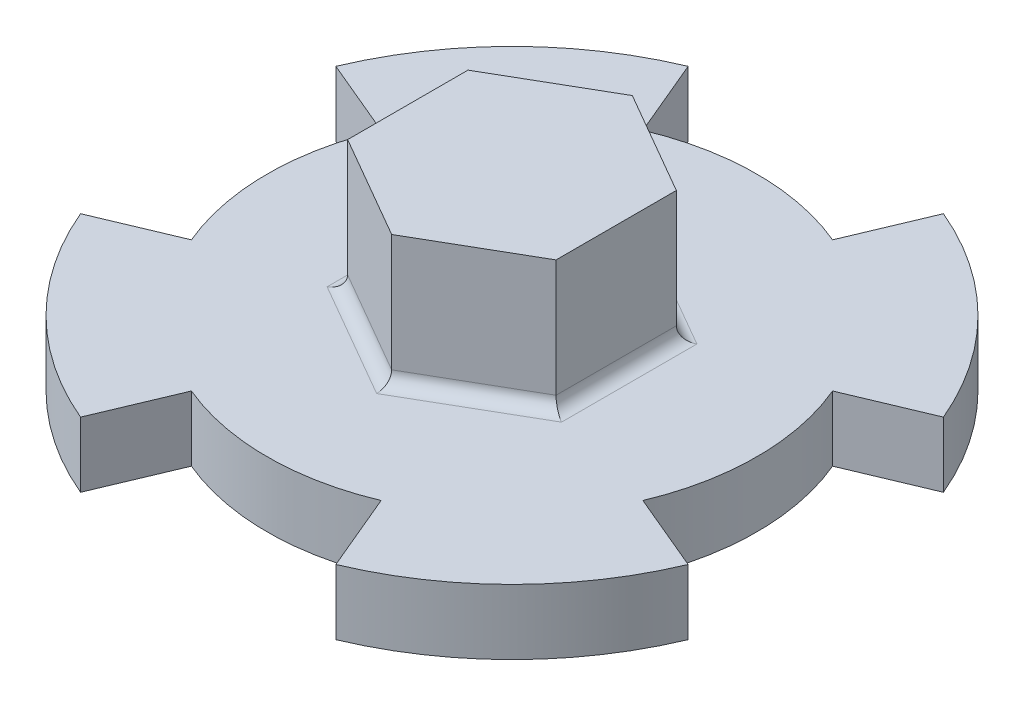
ISO-10303-21;
HEADER;
FILE_DESCRIPTION(('STEP AP214'),'2;1');
FILE_NAME('part.step','',(''),(''),'','','');
FILE_SCHEMA(('AUTOMOTIVE_DESIGN { 1 0 10303 214 1 1 1 1 }'));
ENDSEC;
DATA;
#1=APPLICATION_CONTEXT('core data for automotive mechanical design processes');
#2=APPLICATION_PROTOCOL_DEFINITION('international standard','automotive_design',2000,#1);
#3=PRODUCT_CONTEXT('',#1,'mechanical');
#4=PRODUCT('Part','Part','',(#3));
#5=PRODUCT_RELATED_PRODUCT_CATEGORY('part','',(#4));
#6=PRODUCT_DEFINITION_FORMATION('','',#4);
#7=PRODUCT_DEFINITION_CONTEXT('part definition',#1,'design');
#8=PRODUCT_DEFINITION('design','',#6,#7);
#9=PRODUCT_DEFINITION_SHAPE('','',#8);
#10=(LENGTH_UNIT() NAMED_UNIT(*) SI_UNIT(.MILLI.,.METRE.));
#11=(NAMED_UNIT(*) PLANE_ANGLE_UNIT() SI_UNIT($,.RADIAN.));
#12=(NAMED_UNIT(*) SI_UNIT($,.STERADIAN.) SOLID_ANGLE_UNIT());
#13=UNCERTAINTY_MEASURE_WITH_UNIT(LENGTH_MEASURE(1.E-05),#10,'distance_accuracy_value','');
#14=(GEOMETRIC_REPRESENTATION_CONTEXT(3) GLOBAL_UNCERTAINTY_ASSIGNED_CONTEXT((#13)) GLOBAL_UNIT_ASSIGNED_CONTEXT((#10,
#11,#12)) REPRESENTATION_CONTEXT('',''));
#15=CARTESIAN_POINT('',(0.,0.,0.));
#16=DIRECTION('',(0.,0.,1.));
#17=DIRECTION('',(1.,0.,0.));
#18=AXIS2_PLACEMENT_3D('',#15,#16,#17);
#19=CARTESIAN_POINT('',(0.,5.,0.));
#20=DIRECTION('',(0.,-1.,0.));
#21=DIRECTION('',(0.,0.,-1.));
#22=AXIS2_PLACEMENT_3D('',#19,#20,#21);
#23=CYLINDRICAL_SURFACE('',#22,18.8);
#24=CARTESIAN_POINT('',(0.,0.,0.));
#25=DIRECTION('',(0.,1.,0.));
#26=DIRECTION('',(0.,0.,1.));
#27=AXIS2_PLACEMENT_3D('',#24,#25,#26);
#28=CIRCLE('',#27,18.8);
#29=CARTESIAN_POINT('',(-7.2822134387353,0.,17.3323214669214));
#30=VERTEX_POINT('',#29);
#31=CARTESIAN_POINT('',(7.28221343873506,0.,17.3323214669215));
#32=VERTEX_POINT('',#31);
#33=EDGE_CURVE('E229',#30,#32,#28,.T.);
#34=ORIENTED_EDGE('',*,*,#33,.T.);
#35=DIRECTION('',(0.,-1.,0.));
#36=VECTOR('',#35,1.);
#37=CARTESIAN_POINT('',(7.28221343873506,5.,17.3323214669215));
#38=LINE('',#37,#36);
#39=CARTESIAN_POINT('',(7.28221343873506,5.,17.3323214669215));
#40=VERTEX_POINT('',#39);
#41=EDGE_CURVE('E385',#40,#32,#38,.T.);
#42=ORIENTED_EDGE('',*,*,#41,.F.);
#43=CARTESIAN_POINT('',(0.,5.,0.));
#44=DIRECTION('',(0.,1.,0.));
#45=DIRECTION('',(0.,0.,1.));
#46=AXIS2_PLACEMENT_3D('',#43,#44,#45);
#47=CIRCLE('',#46,18.8);
#48=CARTESIAN_POINT('',(-7.2822134387353,5.,17.3323214669214));
#49=VERTEX_POINT('',#48);
#50=EDGE_CURVE('E242',#49,#40,#47,.T.);
#51=ORIENTED_EDGE('',*,*,#50,.F.);
#52=DIRECTION('',(0.,-1.,0.));
#53=VECTOR('',#52,1.);
#54=CARTESIAN_POINT('',(-7.2822134387353,5.,17.3323214669214));
#55=LINE('',#54,#53);
#56=EDGE_CURVE('E289',#49,#30,#55,.T.);
#57=ORIENTED_EDGE('',*,*,#56,.T.);
#58=EDGE_LOOP('',(#34,#42,#51,#57));
#59=FACE_BOUND('',#58,.T.);
#60=ADVANCED_FACE('F39',(#59),#23,.T.);
#61=CARTESIAN_POINT('',(0.,5.,0.));
#62=DIRECTION('',(0.921931992921354,0.,-0.38735177865612));
#63=DIRECTION('',(-0.38735177865612,0.,-0.921931992921355));
#64=AXIS2_PLACEMENT_3D('',#61,#62,#63);
#65=PLANE('',#64);
#66=DIRECTION('',(0.38735177865612,0.,0.921931992921354));
#67=VECTOR('',#66,1.);
#68=CARTESIAN_POINT('',(0.,0.,0.));
#69=LINE('',#68,#67);
#70=CARTESIAN_POINT('',(9.79999999999984,0.,23.3248794209103));
#71=VERTEX_POINT('',#70);
#72=EDGE_CURVE('E234',#32,#71,#69,.T.);
#73=ORIENTED_EDGE('',*,*,#72,.T.);
#74=DIRECTION('',(0.,-1.,0.));
#75=VECTOR('',#74,1.);
#76=CARTESIAN_POINT('',(9.79999999999984,5.,23.3248794209103));
#77=LINE('',#76,#75);
#78=CARTESIAN_POINT('',(9.79999999999984,5.,23.3248794209103));
#79=VERTEX_POINT('',#78);
#80=EDGE_CURVE('E381',#79,#71,#77,.T.);
#81=ORIENTED_EDGE('',*,*,#80,.F.);
#82=DIRECTION('',(0.38735177865612,0.,0.921931992921354));
#83=VECTOR('',#82,1.);
#84=CARTESIAN_POINT('',(0.,5.,0.));
#85=LINE('',#84,#83);
#86=EDGE_CURVE('E246',#40,#79,#85,.T.);
#87=ORIENTED_EDGE('',*,*,#86,.F.);
#88=ORIENTED_EDGE('',*,*,#41,.T.);
#89=EDGE_LOOP('',(#73,#81,#87,#88));
#90=FACE_BOUND('',#89,.T.);
#91=ADVANCED_FACE('F505',(#90),#65,.F.);
#92=CARTESIAN_POINT('',(0.,5.,0.));
#93=DIRECTION('',(0.,-1.,0.));
#94=DIRECTION('',(0.,0.,-1.));
#95=AXIS2_PLACEMENT_3D('',#92,#93,#94);
#96=CYLINDRICAL_SURFACE('',#95,25.3);
#97=CARTESIAN_POINT('',(0.,0.,0.));
#98=DIRECTION('',(0.,1.,0.));
#99=DIRECTION('',(0.,0.,1.));
#100=AXIS2_PLACEMENT_3D('',#97,#98,#99);
#101=CIRCLE('',#100,25.3);
#102=CARTESIAN_POINT('',(23.3248794209102,0.,9.8));
#103=VERTEX_POINT('',#102);
#104=EDGE_CURVE('E293',#71,#103,#101,.T.);
#105=ORIENTED_EDGE('',*,*,#104,.T.);
#106=DIRECTION('',(0.,-1.,0.));
#107=VECTOR('',#106,1.);
#108=CARTESIAN_POINT('',(23.3248794209102,5.,9.8));
#109=LINE('',#108,#107);
#110=CARTESIAN_POINT('',(23.3248794209102,5.,9.8));
#111=VERTEX_POINT('',#110);
#112=EDGE_CURVE('E378',#111,#103,#109,.T.);
#113=ORIENTED_EDGE('',*,*,#112,.F.);
#114=CARTESIAN_POINT('',(0.,5.,0.));
#115=DIRECTION('',(0.,1.,0.));
#116=DIRECTION('',(0.,0.,1.));
#117=AXIS2_PLACEMENT_3D('',#114,#115,#116);
#118=CIRCLE('',#117,25.3);
#119=EDGE_CURVE('E252',#79,#111,#118,.T.);
#120=ORIENTED_EDGE('',*,*,#119,.F.);
#121=ORIENTED_EDGE('',*,*,#80,.T.);
#122=EDGE_LOOP('',(#105,#113,#120,#121));
#123=FACE_BOUND('',#122,.T.);
#124=ADVANCED_FACE('F513',(#123),#96,.T.);
#125=CARTESIAN_POINT('',(0.,5.,0.));
#126=DIRECTION('',(0.387351778656127,0.,-0.921931992921352));
#127=DIRECTION('',(-0.921931992921352,0.,-0.387351778656127));
#128=AXIS2_PLACEMENT_3D('',#125,#126,#127);
#129=PLANE('',#128);
#130=DIRECTION('',(0.921931992921352,0.,0.387351778656127));
#131=VECTOR('',#130,1.);
#132=CARTESIAN_POINT('',(0.,0.,0.));
#133=LINE('',#132,#131);
#134=CARTESIAN_POINT('',(17.3323214669214,0.,7.28221343873518));
#135=VERTEX_POINT('',#134);
#136=EDGE_CURVE('E297',#135,#103,#133,.T.);
#137=ORIENTED_EDGE('',*,*,#136,.F.);
#138=DIRECTION('',(0.,-1.,0.));
#139=VECTOR('',#138,1.);
#140=CARTESIAN_POINT('',(17.3323214669214,5.,7.28221343873518));
#141=LINE('',#140,#139);
#142=CARTESIAN_POINT('',(17.3323214669214,5.,7.28221343873518));
#143=VERTEX_POINT('',#142);
#144=EDGE_CURVE('E375',#143,#135,#141,.T.);
#145=ORIENTED_EDGE('',*,*,#144,.F.);
#146=DIRECTION('',(0.921931992921352,0.,0.387351778656127));
#147=VECTOR('',#146,1.);
#148=CARTESIAN_POINT('',(0.,5.,0.));
#149=LINE('',#148,#147);
#150=EDGE_CURVE('E255',#143,#111,#149,.T.);
#151=ORIENTED_EDGE('',*,*,#150,.T.);
#152=ORIENTED_EDGE('',*,*,#112,.T.);
#153=EDGE_LOOP('',(#137,#145,#151,#152));
#154=FACE_BOUND('',#153,.T.);
#155=ADVANCED_FACE('F520',(#154),#129,.T.);
#156=CARTESIAN_POINT('',(17.3323214669214,0.,-7.28221343873518));
#157=VERTEX_POINT('',#156);
#158=EDGE_CURVE('E237',#135,#157,#28,.T.);
#159=ORIENTED_EDGE('',*,*,#158,.T.);
#160=DIRECTION('',(0.,-1.,0.));
#161=VECTOR('',#160,1.);
#162=CARTESIAN_POINT('',(17.3323214669214,5.,-7.28221343873518));
#163=LINE('',#162,#161);
#164=CARTESIAN_POINT('',(17.3323214669214,5.,-7.28221343873518));
#165=VERTEX_POINT('',#164);
#166=EDGE_CURVE('E371',#165,#157,#163,.T.);
#167=ORIENTED_EDGE('',*,*,#166,.F.);
#168=EDGE_CURVE('E249',#143,#165,#47,.T.);
#169=ORIENTED_EDGE('',*,*,#168,.F.);
#170=ORIENTED_EDGE('',*,*,#144,.T.);
#171=EDGE_LOOP('',(#159,#167,#169,#170));
#172=FACE_BOUND('',#171,.T.);
#173=ADVANCED_FACE('F508',(#172),#23,.T.);
#174=CARTESIAN_POINT('',(0.,5.,0.));
#175=DIRECTION('',(-0.387351778656127,0.,-0.921931992921352));
#176=DIRECTION('',(-0.921931992921352,0.,0.387351778656127));
#177=AXIS2_PLACEMENT_3D('',#174,#175,#176);
#178=PLANE('',#177);
#179=DIRECTION('',(0.921931992921352,0.,-0.387351778656127));
#180=VECTOR('',#179,1.);
#181=CARTESIAN_POINT('',(0.,0.,0.));
#182=LINE('',#181,#180);
#183=CARTESIAN_POINT('',(23.3248794209102,0.,-9.80000000000001));
#184=VERTEX_POINT('',#183);
#185=EDGE_CURVE('E301',#157,#184,#182,.T.);
#186=ORIENTED_EDGE('',*,*,#185,.T.);
#187=DIRECTION('',(0.,-1.,0.));
#188=VECTOR('',#187,1.);
#189=CARTESIAN_POINT('',(23.3248794209102,5.,-9.80000000000001));
#190=LINE('',#189,#188);
#191=CARTESIAN_POINT('',(23.3248794209102,5.,-9.80000000000001));
#192=VERTEX_POINT('',#191);
#193=EDGE_CURVE('E367',#192,#184,#190,.T.);
#194=ORIENTED_EDGE('',*,*,#193,.F.);
#195=DIRECTION('',(0.921931992921352,0.,-0.387351778656127));
#196=VECTOR('',#195,1.);
#197=CARTESIAN_POINT('',(0.,5.,0.));
#198=LINE('',#197,#196);
#199=EDGE_CURVE('E259',#165,#192,#198,.T.);
#200=ORIENTED_EDGE('',*,*,#199,.F.);
#201=ORIENTED_EDGE('',*,*,#166,.T.);
#202=EDGE_LOOP('',(#186,#194,#200,#201));
#203=FACE_BOUND('',#202,.T.);
#204=ADVANCED_FACE('F519',(#203),#178,.F.);
#205=CARTESIAN_POINT('',(0.,5.,0.));
#206=DIRECTION('',(0.,-1.,0.));
#207=DIRECTION('',(0.,0.,-1.));
#208=AXIS2_PLACEMENT_3D('',#205,#206,#207);
#209=CYLINDRICAL_SURFACE('',#208,25.3);
#210=CARTESIAN_POINT('',(0.,0.,0.));
#211=DIRECTION('',(0.,1.,0.));
#212=DIRECTION('',(0.,0.,1.));
#213=AXIS2_PLACEMENT_3D('',#210,#211,#212);
#214=CIRCLE('',#213,25.3);
#215=CARTESIAN_POINT('',(9.8,0.,-23.3248794209102));
#216=VERTEX_POINT('',#215);
#217=EDGE_CURVE('E304',#184,#216,#214,.T.);
#218=ORIENTED_EDGE('',*,*,#217,.T.);
#219=DIRECTION('',(0.,-1.,0.));
#220=VECTOR('',#219,1.);
#221=CARTESIAN_POINT('',(9.8,5.,-23.3248794209102));
#222=LINE('',#221,#220);
#223=CARTESIAN_POINT('',(9.8,5.,-23.3248794209102));
#224=VERTEX_POINT('',#223);
#225=EDGE_CURVE('E364',#224,#216,#222,.T.);
#226=ORIENTED_EDGE('',*,*,#225,.F.);
#227=CARTESIAN_POINT('',(0.,5.,0.));
#228=DIRECTION('',(0.,1.,0.));
#229=DIRECTION('',(0.,0.,1.));
#230=AXIS2_PLACEMENT_3D('',#227,#228,#229);
#231=CIRCLE('',#230,25.3);
#232=EDGE_CURVE('E262',#192,#224,#231,.T.);
#233=ORIENTED_EDGE('',*,*,#232,.F.);
#234=ORIENTED_EDGE('',*,*,#193,.T.);
#235=EDGE_LOOP('',(#218,#226,#233,#234));
#236=FACE_BOUND('',#235,.T.);
#237=ADVANCED_FACE('F545',(#236),#209,.T.);
#238=CARTESIAN_POINT('',(0.,5.,0.));
#239=DIRECTION('',(-0.921931992921352,0.,-0.387351778656126));
#240=DIRECTION('',(-0.387351778656126,0.,0.921931992921352));
#241=AXIS2_PLACEMENT_3D('',#238,#239,#240);
#242=PLANE('',#241);
#243=DIRECTION('',(0.387351778656126,0.,-0.921931992921352));
#244=VECTOR('',#243,1.);
#245=CARTESIAN_POINT('',(0.,0.,0.));
#246=LINE('',#245,#244);
#247=CARTESIAN_POINT('',(7.28221343873518,0.,-17.3323214669214));
#248=VERTEX_POINT('',#247);
#249=EDGE_CURVE('E308',#248,#216,#246,.T.);
#250=ORIENTED_EDGE('',*,*,#249,.F.);
#251=DIRECTION('',(0.,-1.,0.));
#252=VECTOR('',#251,1.);
#253=CARTESIAN_POINT('',(7.28221343873518,5.,-17.3323214669214));
#254=LINE('',#253,#252);
#255=CARTESIAN_POINT('',(7.28221343873518,5.,-17.3323214669214));
#256=VERTEX_POINT('',#255);
#257=EDGE_CURVE('E361',#256,#248,#254,.T.);
#258=ORIENTED_EDGE('',*,*,#257,.F.);
#259=DIRECTION('',(0.387351778656126,0.,-0.921931992921352));
#260=VECTOR('',#259,1.);
#261=CARTESIAN_POINT('',(0.,5.,0.));
#262=LINE('',#261,#260);
#263=EDGE_CURVE('E265',#256,#224,#262,.T.);
#264=ORIENTED_EDGE('',*,*,#263,.T.);
#265=ORIENTED_EDGE('',*,*,#225,.T.);
#266=EDGE_LOOP('',(#250,#258,#264,#265));
#267=FACE_BOUND('',#266,.T.);
#268=ADVANCED_FACE('F537',(#267),#242,.T.);
#269=CARTESIAN_POINT('',(-7.28221343873518,0.,-17.3323214669214));
#270=VERTEX_POINT('',#269);
#271=EDGE_CURVE('E312',#248,#270,#28,.T.);
#272=ORIENTED_EDGE('',*,*,#271,.T.);
#273=DIRECTION('',(0.,-1.,0.));
#274=VECTOR('',#273,1.);
#275=CARTESIAN_POINT('',(-7.28221343873518,5.,-17.3323214669214));
#276=LINE('',#275,#274);
#277=CARTESIAN_POINT('',(-7.28221343873518,5.,-17.3323214669214));
#278=VERTEX_POINT('',#277);
#279=EDGE_CURVE('E357',#278,#270,#276,.T.);
#280=ORIENTED_EDGE('',*,*,#279,.F.);
#281=EDGE_CURVE('E269',#256,#278,#47,.T.);
#282=ORIENTED_EDGE('',*,*,#281,.F.);
#283=ORIENTED_EDGE('',*,*,#257,.T.);
#284=EDGE_LOOP('',(#272,#280,#282,#283));
#285=FACE_BOUND('',#284,.T.);
#286=ADVANCED_FACE('F522',(#285),#23,.T.);
#287=CARTESIAN_POINT('',(0.,5.,0.));
#288=DIRECTION('',(-0.921931992921352,0.,0.387351778656126));
#289=DIRECTION('',(0.387351778656126,0.,0.921931992921352));
#290=AXIS2_PLACEMENT_3D('',#287,#288,#289);
#291=PLANE('',#290);
#292=DIRECTION('',(-0.387351778656126,0.,-0.921931992921352));
#293=VECTOR('',#292,1.);
#294=CARTESIAN_POINT('',(0.,0.,0.));
#295=LINE('',#294,#293);
#296=CARTESIAN_POINT('',(-9.8,0.,-23.3248794209102));
#297=VERTEX_POINT('',#296);
#298=EDGE_CURVE('E313',#270,#297,#295,.T.);
#299=ORIENTED_EDGE('',*,*,#298,.T.);
#300=DIRECTION('',(0.,-1.,0.));
#301=VECTOR('',#300,1.);
#302=CARTESIAN_POINT('',(-9.8,5.,-23.3248794209102));
#303=LINE('',#302,#301);
#304=CARTESIAN_POINT('',(-9.8,5.,-23.3248794209102));
#305=VERTEX_POINT('',#304);
#306=EDGE_CURVE('E353',#305,#297,#303,.T.);
#307=ORIENTED_EDGE('',*,*,#306,.F.);
#308=DIRECTION('',(-0.387351778656126,0.,-0.921931992921352));
#309=VECTOR('',#308,1.);
#310=CARTESIAN_POINT('',(0.,5.,0.));
#311=LINE('',#310,#309);
#312=EDGE_CURVE('E270',#278,#305,#311,.T.);
#313=ORIENTED_EDGE('',*,*,#312,.F.);
#314=ORIENTED_EDGE('',*,*,#279,.T.);
#315=EDGE_LOOP('',(#299,#307,#313,#314));
#316=FACE_BOUND('',#315,.T.);
#317=ADVANCED_FACE('F536',(#316),#291,.F.);
#318=CARTESIAN_POINT('',(0.,5.,0.));
#319=DIRECTION('',(0.,-1.,0.));
#320=DIRECTION('',(0.,0.,-1.));
#321=AXIS2_PLACEMENT_3D('',#318,#319,#320);
#322=CYLINDRICAL_SURFACE('',#321,25.3);
#323=CARTESIAN_POINT('',(0.,0.,0.));
#324=DIRECTION('',(0.,1.,0.));
#325=DIRECTION('',(0.,0.,1.));
#326=AXIS2_PLACEMENT_3D('',#323,#324,#325);
#327=CIRCLE('',#326,25.3);
#328=CARTESIAN_POINT('',(-23.3248794209102,0.,-9.79999999999999));
#329=VERTEX_POINT('',#328);
#330=EDGE_CURVE('E316',#297,#329,#327,.T.);
#331=ORIENTED_EDGE('',*,*,#330,.T.);
#332=DIRECTION('',(0.,-1.,0.));
#333=VECTOR('',#332,1.);
#334=CARTESIAN_POINT('',(-23.3248794209102,5.,-9.79999999999999));
#335=LINE('',#334,#333);
#336=CARTESIAN_POINT('',(-23.3248794209102,5.,-9.79999999999999));
#337=VERTEX_POINT('',#336);
#338=EDGE_CURVE('E350',#337,#329,#335,.T.);
#339=ORIENTED_EDGE('',*,*,#338,.F.);
#340=CARTESIAN_POINT('',(0.,5.,0.));
#341=DIRECTION('',(0.,1.,0.));
#342=DIRECTION('',(0.,0.,1.));
#343=AXIS2_PLACEMENT_3D('',#340,#341,#342);
#344=CIRCLE('',#343,25.3);
#345=EDGE_CURVE('E273',#305,#337,#344,.T.);
#346=ORIENTED_EDGE('',*,*,#345,.F.);
#347=ORIENTED_EDGE('',*,*,#306,.T.);
#348=EDGE_LOOP('',(#331,#339,#346,#347));
#349=FACE_BOUND('',#348,.T.);
#350=ADVANCED_FACE('F533',(#349),#322,.T.);
#351=CARTESIAN_POINT('',(0.,5.,0.));
#352=DIRECTION('',(-0.387351778656126,0.,0.921931992921352));
#353=DIRECTION('',(0.921931992921352,0.,0.387351778656126));
#354=AXIS2_PLACEMENT_3D('',#351,#352,#353);
#355=PLANE('',#354);
#356=DIRECTION('',(-0.921931992921352,0.,-0.387351778656126));
#357=VECTOR('',#356,1.);
#358=CARTESIAN_POINT('',(0.,0.,0.));
#359=LINE('',#358,#357);
#360=CARTESIAN_POINT('',(-17.3323214669214,0.,-7.28221343873517));
#361=VERTEX_POINT('',#360);
#362=EDGE_CURVE('E320',#361,#329,#359,.T.);
#363=ORIENTED_EDGE('',*,*,#362,.F.);
#364=DIRECTION('',(0.,-1.,0.));
#365=VECTOR('',#364,1.);
#366=CARTESIAN_POINT('',(-17.3323214669214,5.,-7.28221343873517));
#367=LINE('',#366,#365);
#368=CARTESIAN_POINT('',(-17.3323214669214,5.,-7.28221343873517));
#369=VERTEX_POINT('',#368);
#370=EDGE_CURVE('E347',#369,#361,#367,.T.);
#371=ORIENTED_EDGE('',*,*,#370,.F.);
#372=DIRECTION('',(-0.921931992921352,0.,-0.387351778656126));
#373=VECTOR('',#372,1.);
#374=CARTESIAN_POINT('',(0.,5.,0.));
#375=LINE('',#374,#373);
#376=EDGE_CURVE('E276',#369,#337,#375,.T.);
#377=ORIENTED_EDGE('',*,*,#376,.T.);
#378=ORIENTED_EDGE('',*,*,#338,.T.);
#379=EDGE_LOOP('',(#363,#371,#377,#378));
#380=FACE_BOUND('',#379,.T.);
#381=ADVANCED_FACE('F525',(#380),#355,.T.);
#382=CARTESIAN_POINT('',(-17.3323214669214,0.,7.28221343873518));
#383=VERTEX_POINT('',#382);
#384=EDGE_CURVE('E236',#361,#383,#28,.T.);
#385=ORIENTED_EDGE('',*,*,#384,.T.);
#386=DIRECTION('',(0.,-1.,0.));
#387=VECTOR('',#386,1.);
#388=CARTESIAN_POINT('',(-17.3323214669214,5.,7.28221343873518));
#389=LINE('',#388,#387);
#390=CARTESIAN_POINT('',(-17.3323214669214,5.,7.28221343873518));
#391=VERTEX_POINT('',#390);
#392=EDGE_CURVE('E343',#391,#383,#389,.T.);
#393=ORIENTED_EDGE('',*,*,#392,.F.);
#394=EDGE_CURVE('E248',#369,#391,#47,.T.);
#395=ORIENTED_EDGE('',*,*,#394,.F.);
#396=ORIENTED_EDGE('',*,*,#370,.T.);
#397=EDGE_LOOP('',(#385,#393,#395,#396));
#398=FACE_BOUND('',#397,.T.);
#399=ADVANCED_FACE('F509',(#398),#23,.T.);
#400=CARTESIAN_POINT('',(0.,5.,0.));
#401=DIRECTION('',(0.387351778656126,0.,0.921931992921352));
#402=DIRECTION('',(0.921931992921352,0.,-0.387351778656126));
#403=AXIS2_PLACEMENT_3D('',#400,#401,#402);
#404=PLANE('',#403);
#405=DIRECTION('',(-0.921931992921352,0.,0.387351778656126));
#406=VECTOR('',#405,1.);
#407=CARTESIAN_POINT('',(0.,0.,0.));
#408=LINE('',#407,#406);
#409=CARTESIAN_POINT('',(-23.3248794209102,0.,9.8));
#410=VERTEX_POINT('',#409);
#411=EDGE_CURVE('E324',#383,#410,#408,.T.);
#412=ORIENTED_EDGE('',*,*,#411,.T.);
#413=DIRECTION('',(0.,-1.,0.));
#414=VECTOR('',#413,1.);
#415=CARTESIAN_POINT('',(-23.3248794209102,5.,9.8));
#416=LINE('',#415,#414);
#417=CARTESIAN_POINT('',(-23.3248794209102,5.,9.8));
#418=VERTEX_POINT('',#417);
#419=EDGE_CURVE('E339',#418,#410,#416,.T.);
#420=ORIENTED_EDGE('',*,*,#419,.F.);
#421=DIRECTION('',(-0.921931992921352,0.,0.387351778656126));
#422=VECTOR('',#421,1.);
#423=CARTESIAN_POINT('',(0.,5.,0.));
#424=LINE('',#423,#422);
#425=EDGE_CURVE('E280',#391,#418,#424,.T.);
#426=ORIENTED_EDGE('',*,*,#425,.F.);
#427=ORIENTED_EDGE('',*,*,#392,.T.);
#428=EDGE_LOOP('',(#412,#420,#426,#427));
#429=FACE_BOUND('',#428,.T.);
#430=ADVANCED_FACE('F524',(#429),#404,.F.);
#431=CARTESIAN_POINT('',(0.,5.,0.));
#432=DIRECTION('',(0.,-1.,0.));
#433=DIRECTION('',(0.,0.,-1.));
#434=AXIS2_PLACEMENT_3D('',#431,#432,#433);
#435=CYLINDRICAL_SURFACE('',#434,25.3);
#436=CARTESIAN_POINT('',(0.,0.,0.));
#437=DIRECTION('',(0.,1.,0.));
#438=DIRECTION('',(0.,0.,1.));
#439=AXIS2_PLACEMENT_3D('',#436,#437,#438);
#440=CIRCLE('',#439,25.3);
#441=CARTESIAN_POINT('',(-9.80000000000016,0.,23.3248794209101));
#442=VERTEX_POINT('',#441);
#443=EDGE_CURVE('E327',#410,#442,#440,.T.);
#444=ORIENTED_EDGE('',*,*,#443,.T.);
#445=DIRECTION('',(0.,-1.,0.));
#446=VECTOR('',#445,1.);
#447=CARTESIAN_POINT('',(-9.80000000000016,5.,23.3248794209101));
#448=LINE('',#447,#446);
#449=CARTESIAN_POINT('',(-9.80000000000016,5.,23.3248794209101));
#450=VERTEX_POINT('',#449);
#451=EDGE_CURVE('E336',#450,#442,#448,.T.);
#452=ORIENTED_EDGE('',*,*,#451,.F.);
#453=CARTESIAN_POINT('',(0.,5.,0.));
#454=DIRECTION('',(0.,1.,0.));
#455=DIRECTION('',(0.,0.,1.));
#456=AXIS2_PLACEMENT_3D('',#453,#454,#455);
#457=CIRCLE('',#456,25.3);
#458=EDGE_CURVE('E283',#418,#450,#457,.T.);
#459=ORIENTED_EDGE('',*,*,#458,.F.);
#460=ORIENTED_EDGE('',*,*,#419,.T.);
#461=EDGE_LOOP('',(#444,#452,#459,#460));
#462=FACE_BOUND('',#461,.T.);
#463=ADVANCED_FACE('F531',(#462),#435,.T.);
#464=CARTESIAN_POINT('',(0.,5.,0.));
#465=DIRECTION('',(0.921931992921349,0.,0.387351778656133));
#466=DIRECTION('',(0.387351778656133,0.,-0.921931992921349));
#467=AXIS2_PLACEMENT_3D('',#464,#465,#466);
#468=PLANE('',#467);
#469=DIRECTION('',(-0.387351778656133,0.,0.921931992921349));
#470=VECTOR('',#469,1.);
#471=CARTESIAN_POINT('',(0.,0.,0.));
#472=LINE('',#471,#470);
#473=EDGE_CURVE('E247',#30,#442,#472,.T.);
#474=ORIENTED_EDGE('',*,*,#473,.F.);
#475=ORIENTED_EDGE('',*,*,#56,.F.);
#476=DIRECTION('',(-0.387351778656133,0.,0.921931992921349));
#477=VECTOR('',#476,1.);
#478=CARTESIAN_POINT('',(0.,5.,0.));
#479=LINE('',#478,#477);
#480=EDGE_CURVE('E286',#49,#450,#479,.T.);
#481=ORIENTED_EDGE('',*,*,#480,.T.);
#482=ORIENTED_EDGE('',*,*,#451,.T.);
#483=EDGE_LOOP('',(#474,#475,#481,#482));
#484=FACE_BOUND('',#483,.T.);
#485=ADVANCED_FACE('F584',(#484),#468,.T.);
#486=CARTESIAN_POINT('',(0.,5.,0.));
#487=DIRECTION('',(0.,1.,0.));
#488=DIRECTION('',(0.,0.,1.));
#489=AXIS2_PLACEMENT_3D('',#486,#487,#488);
#490=PLANE('',#489);
#491=DIRECTION('',(0.,0.,-1.));
#492=VECTOR('',#491,1.);
#493=CARTESIAN_POINT('',(9.,5.,0.));
#494=LINE('',#493,#492);
#495=CARTESIAN_POINT('',(9.,5.,-5.19615242270663));
#496=VERTEX_POINT('',#495);
#497=CARTESIAN_POINT('',(9.,5.,5.19615242270663));
#498=VERTEX_POINT('',#497);
#499=EDGE_CURVE('E393',#496,#498,#494,.F.);
#500=ORIENTED_EDGE('',*,*,#499,.T.);
#501=DIRECTION('',(0.866025403784439,0.,-0.5));
#502=VECTOR('',#501,1.);
#503=CARTESIAN_POINT('',(4.5,5.,7.79422863405995));
#504=LINE('',#503,#502);
#505=CARTESIAN_POINT('',(0.,5.,10.3923048454133));
#506=VERTEX_POINT('',#505);
#507=EDGE_CURVE('E408',#498,#506,#504,.F.);
#508=ORIENTED_EDGE('',*,*,#507,.T.);
#509=DIRECTION('',(0.866025403784439,0.,0.5));
#510=VECTOR('',#509,1.);
#511=CARTESIAN_POINT('',(-4.5,5.,7.79422863405995));
#512=LINE('',#511,#510);
#513=CARTESIAN_POINT('',(-9.,5.,5.19615242270663));
#514=VERTEX_POINT('',#513);
#515=EDGE_CURVE('E405',#506,#514,#512,.F.);
#516=ORIENTED_EDGE('',*,*,#515,.T.);
#517=DIRECTION('',(0.,0.,1.));
#518=VECTOR('',#517,1.);
#519=CARTESIAN_POINT('',(-9.,5.,0.));
#520=LINE('',#519,#518);
#521=CARTESIAN_POINT('',(-9.,5.,-5.19615242270663));
#522=VERTEX_POINT('',#521);
#523=EDGE_CURVE('E402',#514,#522,#520,.F.);
#524=ORIENTED_EDGE('',*,*,#523,.T.);
#525=DIRECTION('',(-0.866025403784439,0.,0.5));
#526=VECTOR('',#525,1.);
#527=CARTESIAN_POINT('',(-4.5,5.,-7.79422863405995));
#528=LINE('',#527,#526);
#529=CARTESIAN_POINT('',(0.,5.,-10.3923048454133));
#530=VERTEX_POINT('',#529);
#531=EDGE_CURVE('E399',#522,#530,#528,.F.);
#532=ORIENTED_EDGE('',*,*,#531,.T.);
#533=DIRECTION('',(-0.866025403784439,0.,-0.5));
#534=VECTOR('',#533,1.);
#535=CARTESIAN_POINT('',(4.5,5.,-7.79422863405995));
#536=LINE('',#535,#534);
#537=EDGE_CURVE('E396',#530,#496,#536,.F.);
#538=ORIENTED_EDGE('',*,*,#537,.T.);
#539=EDGE_LOOP('',(#500,#508,#516,#524,#532,#538));
#540=FACE_BOUND('',#539,.T.);
#541=ORIENTED_EDGE('',*,*,#50,.T.);
#542=ORIENTED_EDGE('',*,*,#86,.T.);
#543=ORIENTED_EDGE('',*,*,#119,.T.);
#544=ORIENTED_EDGE('',*,*,#150,.F.);
#545=ORIENTED_EDGE('',*,*,#168,.T.);
#546=ORIENTED_EDGE('',*,*,#199,.T.);
#547=ORIENTED_EDGE('',*,*,#232,.T.);
#548=ORIENTED_EDGE('',*,*,#263,.F.);
#549=ORIENTED_EDGE('',*,*,#281,.T.);
#550=ORIENTED_EDGE('',*,*,#312,.T.);
#551=ORIENTED_EDGE('',*,*,#345,.T.);
#552=ORIENTED_EDGE('',*,*,#376,.F.);
#553=ORIENTED_EDGE('',*,*,#394,.T.);
#554=ORIENTED_EDGE('',*,*,#425,.T.);
#555=ORIENTED_EDGE('',*,*,#458,.T.);
#556=ORIENTED_EDGE('',*,*,#480,.F.);
#557=EDGE_LOOP('',(#541,#542,#543,#544,#545,#546,#547,#548,#549,#550,#551,#552,#553,#554,#555,#556));
#558=FACE_BOUND('',#557,.T.);
#559=ADVANCED_FACE('F453',(#540,#558),#490,.T.);
#560=CARTESIAN_POINT('',(0.,0.,0.));
#561=DIRECTION('',(0.,1.,0.));
#562=DIRECTION('',(0.,0.,1.));
#563=AXIS2_PLACEMENT_3D('',#560,#561,#562);
#564=PLANE('',#563);
#565=ORIENTED_EDGE('',*,*,#33,.F.);
#566=ORIENTED_EDGE('',*,*,#473,.T.);
#567=ORIENTED_EDGE('',*,*,#443,.F.);
#568=ORIENTED_EDGE('',*,*,#411,.F.);
#569=ORIENTED_EDGE('',*,*,#384,.F.);
#570=ORIENTED_EDGE('',*,*,#362,.T.);
#571=ORIENTED_EDGE('',*,*,#330,.F.);
#572=ORIENTED_EDGE('',*,*,#298,.F.);
#573=ORIENTED_EDGE('',*,*,#271,.F.);
#574=ORIENTED_EDGE('',*,*,#249,.T.);
#575=ORIENTED_EDGE('',*,*,#217,.F.);
#576=ORIENTED_EDGE('',*,*,#185,.F.);
#577=ORIENTED_EDGE('',*,*,#158,.F.);
#578=ORIENTED_EDGE('',*,*,#136,.T.);
#579=ORIENTED_EDGE('',*,*,#104,.F.);
#580=ORIENTED_EDGE('',*,*,#72,.F.);
#581=EDGE_LOOP('',(#565,#566,#567,#568,#569,#570,#571,#572,#573,#574,#575,#576,#577,#578,#579,#580));
#582=FACE_BOUND('',#581,.T.);
#583=ADVANCED_FACE('F559',(#582),#564,.F.);
#584=CARTESIAN_POINT('',(8.,15.,-4.61880215351701));
#585=DIRECTION('',(-0.5,0.,0.866025403784439));
#586=DIRECTION('',(0.866025403784439,0.,0.5));
#587=AXIS2_PLACEMENT_3D('',#584,#585,#586);
#588=PLANE('',#587);
#589=DIRECTION('',(0.,-1.,0.));
#590=VECTOR('',#589,1.);
#591=CARTESIAN_POINT('',(8.,15.,-4.61880215351701));
#592=LINE('',#591,#590);
#593=CARTESIAN_POINT('',(8.,15.,-4.61880215351701));
#594=VERTEX_POINT('',#593);
#595=CARTESIAN_POINT('',(8.,6.,-4.61880215351701));
#596=VERTEX_POINT('',#595);
#597=EDGE_CURVE('E481',#594,#596,#592,.T.);
#598=ORIENTED_EDGE('',*,*,#597,.T.);
#599=DIRECTION('',(-0.866025403784439,0.,-0.5));
#600=VECTOR('',#599,1.);
#601=CARTESIAN_POINT('',(8.,6.,-4.61880215351701));
#602=LINE('',#601,#600);
#603=CARTESIAN_POINT('',(0.,6.,-9.23760430703401));
#604=VERTEX_POINT('',#603);
#605=EDGE_CURVE('E49',#596,#604,#602,.T.);
#606=ORIENTED_EDGE('',*,*,#605,.T.);
#607=DIRECTION('',(0.,-1.,0.));
#608=VECTOR('',#607,1.);
#609=CARTESIAN_POINT('',(0.,15.,-9.23760430703401));
#610=LINE('',#609,#608);
#611=CARTESIAN_POINT('',(0.,15.,-9.23760430703401));
#612=VERTEX_POINT('',#611);
#613=EDGE_CURVE('E211',#612,#604,#610,.T.);
#614=ORIENTED_EDGE('',*,*,#613,.F.);
#615=DIRECTION('',(-0.866025403784439,0.,-0.5));
#616=VECTOR('',#615,1.);
#617=CARTESIAN_POINT('',(8.,15.,-4.61880215351701));
#618=LINE('',#617,#616);
#619=EDGE_CURVE('E219',#594,#612,#618,.T.);
#620=ORIENTED_EDGE('',*,*,#619,.F.);
#621=EDGE_LOOP('',(#598,#606,#614,#620));
#622=FACE_BOUND('',#621,.T.);
#623=ADVANCED_FACE('F227',(#622),#588,.F.);
#624=CARTESIAN_POINT('',(0.,15.,-9.23760430703401));
#625=DIRECTION('',(0.5,0.,0.866025403784439));
#626=DIRECTION('',(0.866025403784439,0.,-0.5));
#627=AXIS2_PLACEMENT_3D('',#624,#625,#626);
#628=PLANE('',#627);
#629=ORIENTED_EDGE('',*,*,#613,.T.);
#630=DIRECTION('',(-0.866025403784439,0.,0.5));
#631=VECTOR('',#630,1.);
#632=CARTESIAN_POINT('',(0.,6.,-9.23760430703401));
#633=LINE('',#632,#631);
#634=CARTESIAN_POINT('',(-8.,6.,-4.61880215351701));
#635=VERTEX_POINT('',#634);
#636=EDGE_CURVE('E418',#604,#635,#633,.T.);
#637=ORIENTED_EDGE('',*,*,#636,.T.);
#638=DIRECTION('',(0.,-1.,0.));
#639=VECTOR('',#638,1.);
#640=CARTESIAN_POINT('',(-8.,15.,-4.61880215351701));
#641=LINE('',#640,#639);
#642=CARTESIAN_POINT('',(-8.,15.,-4.61880215351701));
#643=VERTEX_POINT('',#642);
#644=EDGE_CURVE('E214',#643,#635,#641,.T.);
#645=ORIENTED_EDGE('',*,*,#644,.F.);
#646=DIRECTION('',(-0.866025403784439,0.,0.5));
#647=VECTOR('',#646,1.);
#648=CARTESIAN_POINT('',(0.,15.,-9.23760430703401));
#649=LINE('',#648,#647);
#650=EDGE_CURVE('E208',#612,#643,#649,.T.);
#651=ORIENTED_EDGE('',*,*,#650,.F.);
#652=EDGE_LOOP('',(#629,#637,#645,#651));
#653=FACE_BOUND('',#652,.T.);
#654=ADVANCED_FACE('F210',(#653),#628,.F.);
#655=CARTESIAN_POINT('',(-8.,15.,-4.61880215351701));
#656=DIRECTION('',(1.,0.,0.));
#657=DIRECTION('',(0.,0.,-1.));
#658=AXIS2_PLACEMENT_3D('',#655,#656,#657);
#659=PLANE('',#658);
#660=ORIENTED_EDGE('',*,*,#644,.T.);
#661=DIRECTION('',(0.,0.,1.));
#662=VECTOR('',#661,1.);
#663=CARTESIAN_POINT('',(-8.,6.,-4.61880215351701));
#664=LINE('',#663,#662);
#665=CARTESIAN_POINT('',(-8.,6.,4.61880215351701));
#666=VERTEX_POINT('',#665);
#667=EDGE_CURVE('E415',#635,#666,#664,.T.);
#668=ORIENTED_EDGE('',*,*,#667,.T.);
#669=DIRECTION('',(0.,-1.,0.));
#670=VECTOR('',#669,1.);
#671=CARTESIAN_POINT('',(-8.,15.,4.61880215351701));
#672=LINE('',#671,#670);
#673=CARTESIAN_POINT('',(-8.,15.,4.61880215351701));
#674=VERTEX_POINT('',#673);
#675=EDGE_CURVE('E238',#674,#666,#672,.T.);
#676=ORIENTED_EDGE('',*,*,#675,.F.);
#677=DIRECTION('',(0.,0.,1.));
#678=VECTOR('',#677,1.);
#679=CARTESIAN_POINT('',(-8.,15.,-4.61880215351701));
#680=LINE('',#679,#678);
#681=EDGE_CURVE('E218',#643,#674,#680,.T.);
#682=ORIENTED_EDGE('',*,*,#681,.F.);
#683=EDGE_LOOP('',(#660,#668,#676,#682));
#684=FACE_BOUND('',#683,.T.);
#685=ADVANCED_FACE('F495',(#684),#659,.F.);
#686=CARTESIAN_POINT('',(-8.,15.,4.61880215351701));
#687=DIRECTION('',(0.5,0.,-0.866025403784439));
#688=DIRECTION('',(-0.866025403784439,0.,-0.5));
#689=AXIS2_PLACEMENT_3D('',#686,#687,#688);
#690=PLANE('',#689);
#691=ORIENTED_EDGE('',*,*,#675,.T.);
#692=DIRECTION('',(0.866025403784439,0.,0.5));
#693=VECTOR('',#692,1.);
#694=CARTESIAN_POINT('',(-8.,6.,4.61880215351701));
#695=LINE('',#694,#693);
#696=CARTESIAN_POINT('',(0.,6.,9.23760430703401));
#697=VERTEX_POINT('',#696);
#698=EDGE_CURVE('E412',#666,#697,#695,.T.);
#699=ORIENTED_EDGE('',*,*,#698,.T.);
#700=DIRECTION('',(0.,-1.,0.));
#701=VECTOR('',#700,1.);
#702=CARTESIAN_POINT('',(0.,15.,9.23760430703401));
#703=LINE('',#702,#701);
#704=CARTESIAN_POINT('',(0.,15.,9.23760430703401));
#705=VERTEX_POINT('',#704);
#706=EDGE_CURVE('E469',#705,#697,#703,.T.);
#707=ORIENTED_EDGE('',*,*,#706,.F.);
#708=DIRECTION('',(0.866025403784438,0.,0.5));
#709=VECTOR('',#708,1.);
#710=CARTESIAN_POINT('',(-8.,15.,4.61880215351701));
#711=LINE('',#710,#709);
#712=EDGE_CURVE('E490',#674,#705,#711,.T.);
#713=ORIENTED_EDGE('',*,*,#712,.F.);
#714=EDGE_LOOP('',(#691,#699,#707,#713));
#715=FACE_BOUND('',#714,.T.);
#716=ADVANCED_FACE('F467',(#715),#690,.F.);
#717=CARTESIAN_POINT('',(0.,15.,9.23760430703401));
#718=DIRECTION('',(-0.5,0.,-0.866025403784439));
#719=DIRECTION('',(-0.866025403784439,0.,0.5));
#720=AXIS2_PLACEMENT_3D('',#717,#718,#719);
#721=PLANE('',#720);
#722=ORIENTED_EDGE('',*,*,#706,.T.);
#723=DIRECTION('',(0.866025403784439,0.,-0.5));
#724=VECTOR('',#723,1.);
#725=CARTESIAN_POINT('',(0.,6.,9.23760430703401));
#726=LINE('',#725,#724);
#727=CARTESIAN_POINT('',(8.,6.,4.61880215351701));
#728=VERTEX_POINT('',#727);
#729=EDGE_CURVE('E389',#697,#728,#726,.T.);
#730=ORIENTED_EDGE('',*,*,#729,.T.);
#731=DIRECTION('',(0.,-1.,0.));
#732=VECTOR('',#731,1.);
#733=CARTESIAN_POINT('',(8.,15.,4.61880215351701));
#734=LINE('',#733,#732);
#735=CARTESIAN_POINT('',(8.,15.,4.61880215351701));
#736=VERTEX_POINT('',#735);
#737=EDGE_CURVE('E477',#736,#728,#734,.T.);
#738=ORIENTED_EDGE('',*,*,#737,.F.);
#739=DIRECTION('',(0.866025403784439,0.,-0.5));
#740=VECTOR('',#739,1.);
#741=CARTESIAN_POINT('',(0.,15.,9.23760430703401));
#742=LINE('',#741,#740);
#743=EDGE_CURVE('E475',#705,#736,#742,.T.);
#744=ORIENTED_EDGE('',*,*,#743,.F.);
#745=EDGE_LOOP('',(#722,#730,#738,#744));
#746=FACE_BOUND('',#745,.T.);
#747=ADVANCED_FACE('F473',(#746),#721,.F.);
#748=CARTESIAN_POINT('',(8.,15.,4.61880215351701));
#749=DIRECTION('',(-1.,0.,0.));
#750=DIRECTION('',(0.,0.,1.));
#751=AXIS2_PLACEMENT_3D('',#748,#749,#750);
#752=PLANE('',#751);
#753=ORIENTED_EDGE('',*,*,#737,.T.);
#754=DIRECTION('',(0.,0.,-1.));
#755=VECTOR('',#754,1.);
#756=CARTESIAN_POINT('',(8.,6.,4.61880215351701));
#757=LINE('',#756,#755);
#758=EDGE_CURVE('E11',#728,#596,#757,.T.);
#759=ORIENTED_EDGE('',*,*,#758,.T.);
#760=ORIENTED_EDGE('',*,*,#597,.F.);
#761=DIRECTION('',(0.,0.,-1.));
#762=VECTOR('',#761,1.);
#763=CARTESIAN_POINT('',(8.,15.,4.61880215351701));
#764=LINE('',#763,#762);
#765=EDGE_CURVE('E224',#736,#594,#764,.T.);
#766=ORIENTED_EDGE('',*,*,#765,.F.);
#767=EDGE_LOOP('',(#753,#759,#760,#766));
#768=FACE_BOUND('',#767,.T.);
#769=ADVANCED_FACE('F636',(#768),#752,.F.);
#770=CARTESIAN_POINT('',(0.,15.,0.));
#771=DIRECTION('',(0.,1.,0.));
#772=DIRECTION('',(0.,0.,1.));
#773=AXIS2_PLACEMENT_3D('',#770,#771,#772);
#774=PLANE('',#773);
#775=ORIENTED_EDGE('',*,*,#619,.T.);
#776=ORIENTED_EDGE('',*,*,#650,.T.);
#777=ORIENTED_EDGE('',*,*,#681,.T.);
#778=ORIENTED_EDGE('',*,*,#712,.T.);
#779=ORIENTED_EDGE('',*,*,#743,.T.);
#780=ORIENTED_EDGE('',*,*,#765,.T.);
#781=EDGE_LOOP('',(#775,#776,#777,#778,#779,#780));
#782=FACE_BOUND('',#781,.T.);
#783=ADVANCED_FACE('F222',(#782),#774,.T.);
#784=CARTESIAN_POINT('',(-0.499999999999998,6.,-10.1036297108185));
#785=DIRECTION('',(-0.866025403784439,0.,0.5));
#786=DIRECTION('',(0.5,0.,0.866025403784439));
#787=AXIS2_PLACEMENT_3D('',#784,#785,#786);
#788=CYLINDRICAL_SURFACE('',#787,1.);
#789=CARTESIAN_POINT('',(0.,6.,-10.3923048454133));
#790=DIRECTION('',(-1.,0.,0.));
#791=DIRECTION('',(0.,0.,-1.));
#792=AXIS2_PLACEMENT_3D('',#789,#790,#791);
#793=ELLIPSE('',#792,1.15470053837925,1.);
#794=EDGE_CURVE('E436',#530,#604,#793,.T.);
#795=ORIENTED_EDGE('',*,*,#794,.F.);
#796=ORIENTED_EDGE('',*,*,#531,.F.);
#797=CARTESIAN_POINT('',(-9.,6.,-5.19615242270663));
#798=DIRECTION('',(-0.5,0.,0.866025403784439));
#799=DIRECTION('',(-0.866025403784439,0.,-0.5));
#800=AXIS2_PLACEMENT_3D('',#797,#798,#799);
#801=ELLIPSE('',#800,1.15470053837925,1.);
#802=EDGE_CURVE('E43',#635,#522,#801,.F.);
#803=ORIENTED_EDGE('',*,*,#802,.F.);
#804=ORIENTED_EDGE('',*,*,#636,.F.);
#805=EDGE_LOOP('',(#795,#796,#803,#804));
#806=FACE_BOUND('',#805,.T.);
#807=ADVANCED_FACE('F41',(#806),#788,.F.);
#808=CARTESIAN_POINT('',(-9.,6.,-4.61880215351701));
#809=DIRECTION('',(0.,0.,1.));
#810=DIRECTION('',(1.,0.,0.));
#811=AXIS2_PLACEMENT_3D('',#808,#809,#810);
#812=CYLINDRICAL_SURFACE('',#811,1.);
#813=ORIENTED_EDGE('',*,*,#802,.T.);
#814=ORIENTED_EDGE('',*,*,#523,.F.);
#815=CARTESIAN_POINT('',(-9.,6.,5.19615242270663));
#816=DIRECTION('',(0.5,0.,0.866025403784439));
#817=DIRECTION('',(-0.866025403784439,0.,0.5));
#818=AXIS2_PLACEMENT_3D('',#815,#816,#817);
#819=ELLIPSE('',#818,1.15470053837925,1.);
#820=EDGE_CURVE('E433',#666,#514,#819,.F.);
#821=ORIENTED_EDGE('',*,*,#820,.F.);
#822=ORIENTED_EDGE('',*,*,#667,.F.);
#823=EDGE_LOOP('',(#813,#814,#821,#822));
#824=FACE_BOUND('',#823,.T.);
#825=ADVANCED_FACE('F448',(#824),#812,.F.);
#826=CARTESIAN_POINT('',(8.5,6.,-5.48482755730145));
#827=DIRECTION('',(-0.866025403784439,0.,-0.5));
#828=DIRECTION('',(-0.5,0.,0.866025403784439));
#829=AXIS2_PLACEMENT_3D('',#826,#827,#828);
#830=CYLINDRICAL_SURFACE('',#829,1.);
#831=ORIENTED_EDGE('',*,*,#794,.T.);
#832=ORIENTED_EDGE('',*,*,#605,.F.);
#833=CARTESIAN_POINT('',(9.,6.,-5.19615242270663));
#834=DIRECTION('',(-0.5,0.,-0.866025403784439));
#835=DIRECTION('',(0.866025403784439,0.,-0.5));
#836=AXIS2_PLACEMENT_3D('',#833,#834,#835);
#837=ELLIPSE('',#836,1.15470053837925,1.);
#838=EDGE_CURVE('E429',#496,#596,#837,.T.);
#839=ORIENTED_EDGE('',*,*,#838,.F.);
#840=ORIENTED_EDGE('',*,*,#537,.F.);
#841=EDGE_LOOP('',(#831,#832,#839,#840));
#842=FACE_BOUND('',#841,.T.);
#843=ADVANCED_FACE('F627',(#842),#830,.F.);
#844=CARTESIAN_POINT('',(-8.5,6.,5.48482755730145));
#845=DIRECTION('',(0.866025403784439,0.,0.5));
#846=DIRECTION('',(0.5,0.,-0.866025403784439));
#847=AXIS2_PLACEMENT_3D('',#844,#845,#846);
#848=CYLINDRICAL_SURFACE('',#847,1.);
#849=ORIENTED_EDGE('',*,*,#820,.T.);
#850=ORIENTED_EDGE('',*,*,#515,.F.);
#851=CARTESIAN_POINT('',(0.,6.,10.3923048454133));
#852=DIRECTION('',(1.,0.,0.));
#853=DIRECTION('',(0.,0.,1.));
#854=AXIS2_PLACEMENT_3D('',#851,#852,#853);
#855=ELLIPSE('',#854,1.15470053837925,1.);
#856=EDGE_CURVE('E426',#697,#506,#855,.F.);
#857=ORIENTED_EDGE('',*,*,#856,.F.);
#858=ORIENTED_EDGE('',*,*,#698,.F.);
#859=EDGE_LOOP('',(#849,#850,#857,#858));
#860=FACE_BOUND('',#859,.T.);
#861=ADVANCED_FACE('F460',(#860),#848,.F.);
#862=CARTESIAN_POINT('',(9.,6.,4.61880215351701));
#863=DIRECTION('',(0.,0.,-1.));
#864=DIRECTION('',(-1.,0.,0.));
#865=AXIS2_PLACEMENT_3D('',#862,#863,#864);
#866=CYLINDRICAL_SURFACE('',#865,1.);
#867=ORIENTED_EDGE('',*,*,#838,.T.);
#868=ORIENTED_EDGE('',*,*,#758,.F.);
#869=CARTESIAN_POINT('',(9.,6.,5.19615242270663));
#870=DIRECTION('',(0.5,0.,-0.866025403784439));
#871=DIRECTION('',(-0.866025403784439,0.,-0.5));
#872=AXIS2_PLACEMENT_3D('',#869,#870,#871);
#873=ELLIPSE('',#872,1.15470053837925,1.);
#874=EDGE_CURVE('E423',#498,#728,#873,.T.);
#875=ORIENTED_EDGE('',*,*,#874,.F.);
#876=ORIENTED_EDGE('',*,*,#499,.F.);
#877=EDGE_LOOP('',(#867,#868,#875,#876));
#878=FACE_BOUND('',#877,.T.);
#879=ADVANCED_FACE('F620',(#878),#866,.F.);
#880=CARTESIAN_POINT('',(0.499999999999998,6.,10.1036297108185));
#881=DIRECTION('',(0.866025403784439,0.,-0.5));
#882=DIRECTION('',(-0.5,0.,-0.866025403784439));
#883=AXIS2_PLACEMENT_3D('',#880,#881,#882);
#884=CYLINDRICAL_SURFACE('',#883,1.);
#885=ORIENTED_EDGE('',*,*,#856,.T.);
#886=ORIENTED_EDGE('',*,*,#507,.F.);
#887=ORIENTED_EDGE('',*,*,#874,.T.);
#888=ORIENTED_EDGE('',*,*,#729,.F.);
#889=EDGE_LOOP('',(#885,#886,#887,#888));
#890=FACE_BOUND('',#889,.T.);
#891=ADVANCED_FACE('F617',(#890),#884,.F.);
#892=CLOSED_SHELL('',(#60,#91,#124,#155,#173,#204,#237,#268,#286,#317,#350,#381,#399,#430,#463,
#485,#559,#583,#623,#654,#685,#716,#747,#769,#783,#807,#825,#843,#861,#879,#891));
#893=MANIFOLD_SOLID_BREP('B2',#892);
#894=ADVANCED_BREP_SHAPE_REPRESENTATION('',(#18,#893),#14);
#895=SHAPE_DEFINITION_REPRESENTATION(#9,#894);
ENDSEC;
END-ISO-10303-21;
